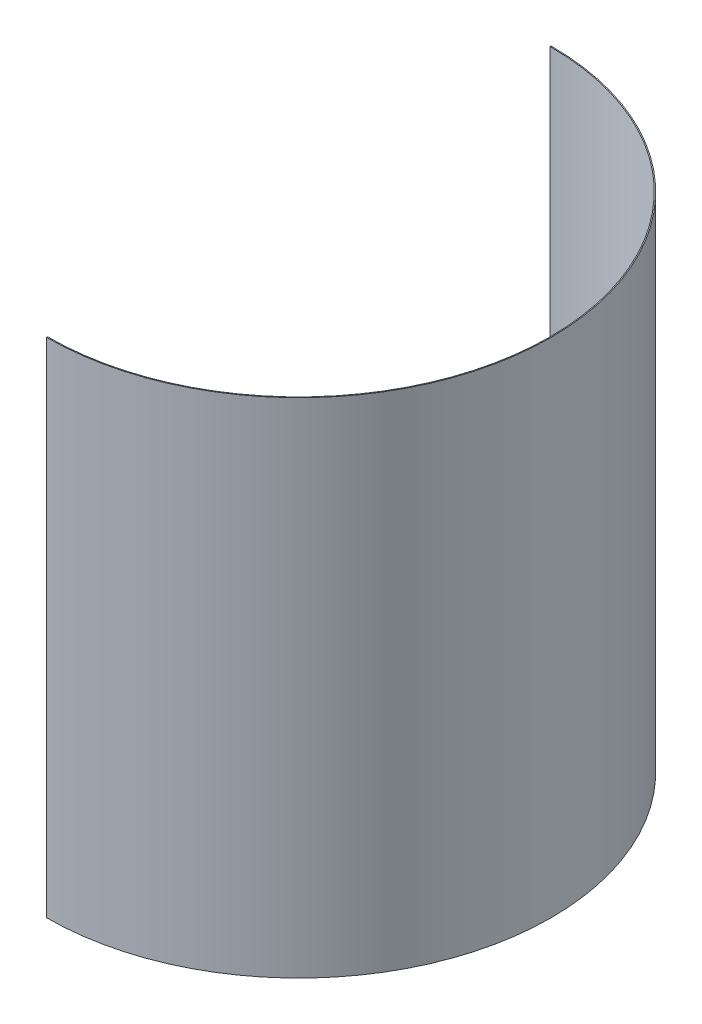
ISO-10303-21;
HEADER;
FILE_DESCRIPTION(('STEP AP214'),'2;1');
FILE_NAME('part.step','',(''),(''),'','','');
FILE_SCHEMA(('AUTOMOTIVE_DESIGN { 1 0 10303 214 1 1 1 1 }'));
ENDSEC;
DATA;
#1=APPLICATION_CONTEXT('core data for automotive mechanical design processes');
#2=APPLICATION_PROTOCOL_DEFINITION('international standard','automotive_design',2000,#1);
#3=PRODUCT_CONTEXT('',#1,'mechanical');
#4=PRODUCT('Part','Part','',(#3));
#5=PRODUCT_RELATED_PRODUCT_CATEGORY('part','',(#4));
#6=PRODUCT_DEFINITION_FORMATION('','',#4);
#7=PRODUCT_DEFINITION_CONTEXT('part definition',#1,'design');
#8=PRODUCT_DEFINITION('design','',#6,#7);
#9=PRODUCT_DEFINITION_SHAPE('','',#8);
#10=(LENGTH_UNIT() NAMED_UNIT(*) SI_UNIT(.MILLI.,.METRE.));
#11=(NAMED_UNIT(*) PLANE_ANGLE_UNIT() SI_UNIT($,.RADIAN.));
#12=(NAMED_UNIT(*) SI_UNIT($,.STERADIAN.) SOLID_ANGLE_UNIT());
#13=UNCERTAINTY_MEASURE_WITH_UNIT(LENGTH_MEASURE(1.E-05),#10,'distance_accuracy_value','');
#14=(GEOMETRIC_REPRESENTATION_CONTEXT(3) GLOBAL_UNCERTAINTY_ASSIGNED_CONTEXT((#13)) GLOBAL_UNIT_ASSIGNED_CONTEXT((#10,
#11,#12)) REPRESENTATION_CONTEXT('',''));
#15=CARTESIAN_POINT('',(0.,0.,0.));
#16=DIRECTION('',(0.,0.,1.));
#17=DIRECTION('',(1.,0.,0.));
#18=AXIS2_PLACEMENT_3D('',#15,#16,#17);
#19=CARTESIAN_POINT('',(4618.5,0.,760.));
#20=DIRECTION('',(1.,0.,0.));
#21=DIRECTION('',(0.,1.,0.));
#22=AXIS2_PLACEMENT_3D('',#19,#20,#21);
#23=PLANE('',#22);
#24=DIRECTION('',(0.,0.,1.));
#25=VECTOR('',#24,1.);
#26=CARTESIAN_POINT('',(4618.5,380.,760.));
#27=LINE('',#26,#25);
#28=CARTESIAN_POINT('',(4618.5,380.,760.));
#29=VERTEX_POINT('',#28);
#30=CARTESIAN_POINT('',(4618.5,380.,761.5));
#31=VERTEX_POINT('',#30);
#32=EDGE_CURVE('E11',#29,#31,#27,.T.);
#33=ORIENTED_EDGE('',*,*,#32,.F.);
#34=DIRECTION('',(0.,1.,0.));
#35=VECTOR('',#34,1.);
#36=CARTESIAN_POINT('',(4618.5,380.,760.));
#37=LINE('',#36,#35);
#38=CARTESIAN_POINT('',(4618.5,-380.,760.));
#39=VERTEX_POINT('',#38);
#40=EDGE_CURVE('E72',#39,#29,#37,.T.);
#41=ORIENTED_EDGE('',*,*,#40,.F.);
#42=DIRECTION('',(0.,0.,1.));
#43=VECTOR('',#42,1.);
#44=CARTESIAN_POINT('',(4618.5,-380.,760.));
#45=LINE('',#44,#43);
#46=CARTESIAN_POINT('',(4618.5,-380.,761.5));
#47=VERTEX_POINT('',#46);
#48=EDGE_CURVE('E44',#39,#47,#45,.T.);
#49=ORIENTED_EDGE('',*,*,#48,.T.);
#50=DIRECTION('',(0.,1.,0.));
#51=VECTOR('',#50,1.);
#52=CARTESIAN_POINT('',(4618.5,380.,761.5));
#53=LINE('',#52,#51);
#54=EDGE_CURVE('E75',#47,#31,#53,.T.);
#55=ORIENTED_EDGE('',*,*,#54,.T.);
#56=EDGE_LOOP('',(#33,#41,#49,#55));
#57=FACE_BOUND('',#56,.T.);
#58=ADVANCED_FACE('F35',(#57),#23,.F.);
#59=CARTESIAN_POINT('',(4618.5,-380.,380.));
#60=DIRECTION('',(0.,-1.,0.));
#61=DIRECTION('',(0.,0.,-1.));
#62=AXIS2_PLACEMENT_3D('',#59,#60,#61);
#63=PLANE('',#62);
#64=ORIENTED_EDGE('',*,*,#48,.F.);
#65=CARTESIAN_POINT('',(4618.5,-380.,380.));
#66=DIRECTION('',(0.,1.,0.));
#67=DIRECTION('',(0.,0.,1.));
#68=AXIS2_PLACEMENT_3D('',#65,#66,#67);
#69=CIRCLE('',#68,380.);
#70=CARTESIAN_POINT('',(4618.5,-380.,0.));
#71=VERTEX_POINT('',#70);
#72=EDGE_CURVE('E82',#71,#39,#69,.F.);
#73=ORIENTED_EDGE('',*,*,#72,.F.);
#74=DIRECTION('',(0.,0.,-1.));
#75=VECTOR('',#74,1.);
#76=CARTESIAN_POINT('',(4618.5,-380.,0.));
#77=LINE('',#76,#75);
#78=CARTESIAN_POINT('',(4618.5,-380.,-1.5));
#79=VERTEX_POINT('',#78);
#80=EDGE_CURVE('E51',#71,#79,#77,.T.);
#81=ORIENTED_EDGE('',*,*,#80,.T.);
#82=CARTESIAN_POINT('',(4618.5,-380.,380.));
#83=DIRECTION('',(0.,1.,0.));
#84=DIRECTION('',(0.,0.,1.));
#85=AXIS2_PLACEMENT_3D('',#82,#83,#84);
#86=CIRCLE('',#85,381.5);
#87=EDGE_CURVE('E99',#79,#47,#86,.F.);
#88=ORIENTED_EDGE('',*,*,#87,.T.);
#89=EDGE_LOOP('',(#64,#73,#81,#88));
#90=FACE_BOUND('',#89,.T.);
#91=ADVANCED_FACE('F102',(#90),#63,.T.);
#92=CARTESIAN_POINT('',(4618.5,380.,380.));
#93=DIRECTION('',(0.,-1.,0.));
#94=DIRECTION('',(0.,0.,-1.));
#95=AXIS2_PLACEMENT_3D('',#92,#93,#94);
#96=PLANE('',#95);
#97=CARTESIAN_POINT('',(4618.5,380.,380.));
#98=DIRECTION('',(0.,1.,0.));
#99=DIRECTION('',(0.,0.,1.));
#100=AXIS2_PLACEMENT_3D('',#97,#98,#99);
#101=CIRCLE('',#100,380.);
#102=CARTESIAN_POINT('',(4618.5,380.,0.));
#103=VERTEX_POINT('',#102);
#104=EDGE_CURVE('E80',#29,#103,#101,.T.);
#105=ORIENTED_EDGE('',*,*,#104,.F.);
#106=ORIENTED_EDGE('',*,*,#32,.T.);
#107=CARTESIAN_POINT('',(4618.5,380.,380.));
#108=DIRECTION('',(0.,1.,0.));
#109=DIRECTION('',(0.,0.,1.));
#110=AXIS2_PLACEMENT_3D('',#107,#108,#109);
#111=CIRCLE('',#110,381.5);
#112=CARTESIAN_POINT('',(4618.5,380.,-1.5));
#113=VERTEX_POINT('',#112);
#114=EDGE_CURVE('E100',#31,#113,#111,.T.);
#115=ORIENTED_EDGE('',*,*,#114,.T.);
#116=DIRECTION('',(0.,0.,-1.));
#117=VECTOR('',#116,1.);
#118=CARTESIAN_POINT('',(4618.5,380.,0.));
#119=LINE('',#118,#117);
#120=EDGE_CURVE('E39',#103,#113,#119,.T.);
#121=ORIENTED_EDGE('',*,*,#120,.F.);
#122=EDGE_LOOP('',(#105,#106,#115,#121));
#123=FACE_BOUND('',#122,.T.);
#124=ADVANCED_FACE('F37',(#123),#96,.F.);
#125=CARTESIAN_POINT('',(4618.5,380.,380.));
#126=DIRECTION('',(0.,1.,0.));
#127=DIRECTION('',(0.,0.,1.));
#128=AXIS2_PLACEMENT_3D('',#125,#126,#127);
#129=CYLINDRICAL_SURFACE('',#128,381.5);
#130=DIRECTION('',(0.,1.,0.));
#131=VECTOR('',#130,1.);
#132=CARTESIAN_POINT('',(4618.5,380.,-1.5));
#133=LINE('',#132,#131);
#134=EDGE_CURVE('E103',#113,#79,#133,.F.);
#135=ORIENTED_EDGE('',*,*,#134,.F.);
#136=ORIENTED_EDGE('',*,*,#114,.F.);
#137=ORIENTED_EDGE('',*,*,#54,.F.);
#138=ORIENTED_EDGE('',*,*,#87,.F.);
#139=EDGE_LOOP('',(#135,#136,#137,#138));
#140=FACE_BOUND('',#139,.T.);
#141=ADVANCED_FACE('F97',(#140),#129,.T.);
#142=CARTESIAN_POINT('',(4618.5,380.,380.));
#143=DIRECTION('',(0.,1.,0.));
#144=DIRECTION('',(0.,0.,1.));
#145=AXIS2_PLACEMENT_3D('',#142,#143,#144);
#146=CYLINDRICAL_SURFACE('',#145,380.);
#147=DIRECTION('',(0.,1.,0.));
#148=VECTOR('',#147,1.);
#149=CARTESIAN_POINT('',(4618.5,380.,0.));
#150=LINE('',#149,#148);
#151=EDGE_CURVE('E86',#103,#71,#150,.F.);
#152=ORIENTED_EDGE('',*,*,#151,.T.);
#153=ORIENTED_EDGE('',*,*,#72,.T.);
#154=ORIENTED_EDGE('',*,*,#40,.T.);
#155=ORIENTED_EDGE('',*,*,#104,.T.);
#156=EDGE_LOOP('',(#152,#153,#154,#155));
#157=FACE_BOUND('',#156,.T.);
#158=ADVANCED_FACE('F78',(#157),#146,.F.);
#159=CARTESIAN_POINT('',(4618.5,380.,0.));
#160=DIRECTION('',(1.,0.,0.));
#161=DIRECTION('',(0.,0.,-1.));
#162=AXIS2_PLACEMENT_3D('',#159,#160,#161);
#163=PLANE('',#162);
#164=ORIENTED_EDGE('',*,*,#134,.T.);
#165=ORIENTED_EDGE('',*,*,#80,.F.);
#166=ORIENTED_EDGE('',*,*,#151,.F.);
#167=ORIENTED_EDGE('',*,*,#120,.T.);
#168=EDGE_LOOP('',(#164,#165,#166,#167));
#169=FACE_BOUND('',#168,.T.);
#170=ADVANCED_FACE('F109',(#169),#163,.F.);
#171=CLOSED_SHELL('',(#58,#91,#124,#141,#158,#170));
#172=MANIFOLD_SOLID_BREP('B2',#171);
#173=ADVANCED_BREP_SHAPE_REPRESENTATION('',(#18,#172),#14);
#174=SHAPE_DEFINITION_REPRESENTATION(#9,#173);
ENDSEC;
END-ISO-10303-21;
